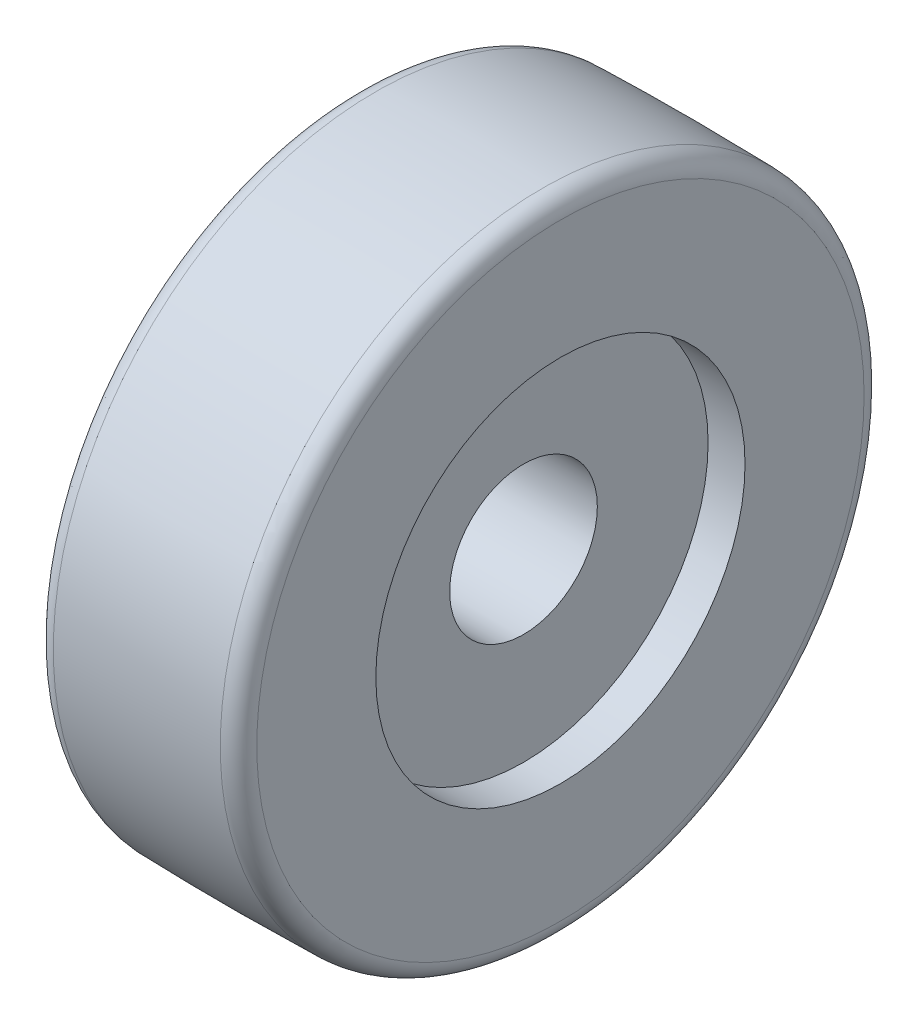
ISO-10303-21;
HEADER;
FILE_DESCRIPTION(('STEP AP214'),'2;1');
FILE_NAME('part.step','',(''),(''),'','','');
FILE_SCHEMA(('AUTOMOTIVE_DESIGN { 1 0 10303 214 1 1 1 1 }'));
ENDSEC;
DATA;
#1=APPLICATION_CONTEXT('core data for automotive mechanical design processes');
#2=APPLICATION_PROTOCOL_DEFINITION('international standard','automotive_design',2000,#1);
#3=PRODUCT_CONTEXT('',#1,'mechanical');
#4=PRODUCT('Part','Part','',(#3));
#5=PRODUCT_RELATED_PRODUCT_CATEGORY('part','',(#4));
#6=PRODUCT_DEFINITION_FORMATION('','',#4);
#7=PRODUCT_DEFINITION_CONTEXT('part definition',#1,'design');
#8=PRODUCT_DEFINITION('design','',#6,#7);
#9=PRODUCT_DEFINITION_SHAPE('','',#8);
#10=(LENGTH_UNIT() NAMED_UNIT(*) SI_UNIT(.MILLI.,.METRE.));
#11=(NAMED_UNIT(*) PLANE_ANGLE_UNIT() SI_UNIT($,.RADIAN.));
#12=(NAMED_UNIT(*) SI_UNIT($,.STERADIAN.) SOLID_ANGLE_UNIT());
#13=UNCERTAINTY_MEASURE_WITH_UNIT(LENGTH_MEASURE(1.E-05),#10,'distance_accuracy_value','');
#14=(GEOMETRIC_REPRESENTATION_CONTEXT(3) GLOBAL_UNCERTAINTY_ASSIGNED_CONTEXT((#13)) GLOBAL_UNIT_ASSIGNED_CONTEXT((#10,
#11,#12)) REPRESENTATION_CONTEXT('',''));
#15=CARTESIAN_POINT('',(0.,0.,0.));
#16=DIRECTION('',(0.,0.,1.));
#17=DIRECTION('',(1.,0.,0.));
#18=AXIS2_PLACEMENT_3D('',#15,#16,#17);
#19=CARTESIAN_POINT('',(-7.87289070741659E-11,0.,0.));
#20=DIRECTION('',(1.,0.,0.));
#21=DIRECTION('',(0.,0.,-1.));
#22=AXIS2_PLACEMENT_3D('',#19,#20,#21);
#23=DEGENERATE_TOROIDAL_SURFACE('',#22,182.499999991458,199.999999991459,.F.);
#24=CARTESIAN_POINT('',(-4.52261306532662,0.,0.));
#25=DIRECTION('',(1.,0.,0.));
#26=DIRECTION('',(0.,0.,-1.));
#27=AXIS2_PLACEMENT_3D('',#24,#25,#26);
#28=CIRCLE('',#27,17.448858388992);
#29=CARTESIAN_POINT('',(-4.52261306532662,0.,-17.448858388992));
#30=VERTEX_POINT('',#29);
#31=EDGE_CURVE('E10',#30,#30,#28,.T.);
#32=ORIENTED_EDGE('',*,*,#31,.T.);
#33=EDGE_LOOP('',(#32));
#34=FACE_BOUND('',#33,.T.);
#35=CARTESIAN_POINT('',(4.52261306532712,0.,0.));
#36=DIRECTION('',(1.,0.,0.));
#37=DIRECTION('',(0.,0.,-1.));
#38=AXIS2_PLACEMENT_3D('',#35,#36,#37);
#39=CIRCLE('',#38,17.4488583889905);
#40=CARTESIAN_POINT('',(4.52261306532712,0.,-17.4488583889905));
#41=VERTEX_POINT('',#40);
#42=EDGE_CURVE('E86',#41,#41,#39,.T.);
#43=ORIENTED_EDGE('',*,*,#42,.F.);
#44=EDGE_LOOP('',(#43));
#45=FACE_BOUND('',#44,.T.);
#46=ADVANCED_FACE('F43',(#34,#45),#23,.F.);
#47=CARTESIAN_POINT('',(-4.5,0.,0.));
#48=DIRECTION('',(1.,0.,0.));
#49=DIRECTION('',(0.,0.,-1.));
#50=AXIS2_PLACEMENT_3D('',#47,#48,#49);
#51=TOROIDAL_SURFACE('',#50,16.4491140970471,0.999999999999966);
#52=CARTESIAN_POINT('',(-5.49999999999997,0.,0.));
#53=DIRECTION('',(1.,0.,0.));
#54=DIRECTION('',(0.,0.,-1.));
#55=AXIS2_PLACEMENT_3D('',#52,#53,#54);
#56=CIRCLE('',#55,16.4491140970471);
#57=CARTESIAN_POINT('',(-5.49999999999997,0.,-16.4491140970471));
#58=VERTEX_POINT('',#57);
#59=EDGE_CURVE('E50',#58,#58,#56,.T.);
#60=ORIENTED_EDGE('',*,*,#59,.T.);
#61=EDGE_LOOP('',(#60));
#62=FACE_BOUND('',#61,.T.);
#63=ORIENTED_EDGE('',*,*,#31,.F.);
#64=EDGE_LOOP('',(#63));
#65=FACE_BOUND('',#64,.T.);
#66=ADVANCED_FACE('F95',(#62,#65),#51,.T.);
#67=CARTESIAN_POINT('',(-5.49999999999998,16.4491140970471,0.));
#68=DIRECTION('',(-1.,0.,0.));
#69=DIRECTION('',(0.,0.,1.));
#70=AXIS2_PLACEMENT_3D('',#67,#68,#69);
#71=PLANE('',#70);
#72=CARTESIAN_POINT('',(-5.5,0.,0.));
#73=DIRECTION('',(1.,0.,0.));
#74=DIRECTION('',(0.,0.,-1.));
#75=AXIS2_PLACEMENT_3D('',#72,#73,#74);
#76=CIRCLE('',#75,10.);
#77=CARTESIAN_POINT('',(-5.5,0.,-10.));
#78=VERTEX_POINT('',#77);
#79=EDGE_CURVE('E55',#78,#78,#76,.T.);
#80=ORIENTED_EDGE('',*,*,#79,.T.);
#81=EDGE_LOOP('',(#80));
#82=FACE_BOUND('',#81,.T.);
#83=ORIENTED_EDGE('',*,*,#59,.F.);
#84=EDGE_LOOP('',(#83));
#85=FACE_BOUND('',#84,.T.);
#86=ADVANCED_FACE('F99',(#82,#85),#71,.T.);
#87=CARTESIAN_POINT('',(-5.5,0.,0.));
#88=DIRECTION('',(1.,0.,0.));
#89=DIRECTION('',(0.,0.,-1.));
#90=AXIS2_PLACEMENT_3D('',#87,#88,#89);
#91=CYLINDRICAL_SURFACE('',#90,10.);
#92=CARTESIAN_POINT('',(-3.5,0.,0.));
#93=DIRECTION('',(1.,0.,0.));
#94=DIRECTION('',(0.,0.,-1.));
#95=AXIS2_PLACEMENT_3D('',#92,#93,#94);
#96=CIRCLE('',#95,10.);
#97=CARTESIAN_POINT('',(-3.5,0.,-10.));
#98=VERTEX_POINT('',#97);
#99=EDGE_CURVE('E60',#98,#98,#96,.T.);
#100=ORIENTED_EDGE('',*,*,#99,.T.);
#101=EDGE_LOOP('',(#100));
#102=FACE_BOUND('',#101,.T.);
#103=ORIENTED_EDGE('',*,*,#79,.F.);
#104=EDGE_LOOP('',(#103));
#105=FACE_BOUND('',#104,.T.);
#106=ADVANCED_FACE('F103',(#102,#105),#91,.F.);
#107=CARTESIAN_POINT('',(-3.5,10.,0.));
#108=DIRECTION('',(-1.,0.,0.));
#109=DIRECTION('',(0.,0.,1.));
#110=AXIS2_PLACEMENT_3D('',#107,#108,#109);
#111=PLANE('',#110);
#112=CARTESIAN_POINT('',(-3.5,0.,0.));
#113=DIRECTION('',(1.,0.,0.));
#114=DIRECTION('',(0.,0.,-1.));
#115=AXIS2_PLACEMENT_3D('',#112,#113,#114);
#116=CIRCLE('',#115,4.);
#117=CARTESIAN_POINT('',(-3.5,0.,-4.));
#118=VERTEX_POINT('',#117);
#119=EDGE_CURVE('E66',#118,#118,#116,.T.);
#120=ORIENTED_EDGE('',*,*,#119,.T.);
#121=EDGE_LOOP('',(#120));
#122=FACE_BOUND('',#121,.T.);
#123=ORIENTED_EDGE('',*,*,#99,.F.);
#124=EDGE_LOOP('',(#123));
#125=FACE_BOUND('',#124,.T.);
#126=ADVANCED_FACE('F110',(#122,#125),#111,.T.);
#127=CARTESIAN_POINT('',(-5.5,0.,0.));
#128=DIRECTION('',(1.,0.,0.));
#129=DIRECTION('',(0.,0.,-1.));
#130=AXIS2_PLACEMENT_3D('',#127,#128,#129);
#131=CYLINDRICAL_SURFACE('',#130,4.);
#132=CARTESIAN_POINT('',(3.5,0.,0.));
#133=DIRECTION('',(1.,0.,0.));
#134=DIRECTION('',(0.,0.,-1.));
#135=AXIS2_PLACEMENT_3D('',#132,#133,#134);
#136=CIRCLE('',#135,4.);
#137=CARTESIAN_POINT('',(3.5,0.,-4.));
#138=VERTEX_POINT('',#137);
#139=EDGE_CURVE('E70',#138,#138,#136,.T.);
#140=ORIENTED_EDGE('',*,*,#139,.T.);
#141=EDGE_LOOP('',(#140));
#142=FACE_BOUND('',#141,.T.);
#143=ORIENTED_EDGE('',*,*,#119,.F.);
#144=EDGE_LOOP('',(#143));
#145=FACE_BOUND('',#144,.T.);
#146=ADVANCED_FACE('F114',(#142,#145),#131,.F.);
#147=CARTESIAN_POINT('',(3.5,4.,0.));
#148=DIRECTION('',(1.,0.,0.));
#149=DIRECTION('',(0.,0.,-1.));
#150=AXIS2_PLACEMENT_3D('',#147,#148,#149);
#151=PLANE('',#150);
#152=CARTESIAN_POINT('',(3.5,0.,0.));
#153=DIRECTION('',(1.,0.,0.));
#154=DIRECTION('',(0.,0.,-1.));
#155=AXIS2_PLACEMENT_3D('',#152,#153,#154);
#156=CIRCLE('',#155,10.);
#157=CARTESIAN_POINT('',(3.5,0.,-10.));
#158=VERTEX_POINT('',#157);
#159=EDGE_CURVE('E74',#158,#158,#156,.T.);
#160=ORIENTED_EDGE('',*,*,#159,.T.);
#161=EDGE_LOOP('',(#160));
#162=FACE_BOUND('',#161,.T.);
#163=ORIENTED_EDGE('',*,*,#139,.F.);
#164=EDGE_LOOP('',(#163));
#165=FACE_BOUND('',#164,.T.);
#166=ADVANCED_FACE('F118',(#162,#165),#151,.T.);
#167=CARTESIAN_POINT('',(-5.5,0.,0.));
#168=DIRECTION('',(1.,0.,0.));
#169=DIRECTION('',(0.,0.,-1.));
#170=AXIS2_PLACEMENT_3D('',#167,#168,#169);
#171=CYLINDRICAL_SURFACE('',#170,10.);
#172=CARTESIAN_POINT('',(5.5,0.,0.));
#173=DIRECTION('',(1.,0.,0.));
#174=DIRECTION('',(0.,0.,-1.));
#175=AXIS2_PLACEMENT_3D('',#172,#173,#174);
#176=CIRCLE('',#175,10.);
#177=CARTESIAN_POINT('',(5.5,0.,-10.));
#178=VERTEX_POINT('',#177);
#179=EDGE_CURVE('E78',#178,#178,#176,.T.);
#180=ORIENTED_EDGE('',*,*,#179,.T.);
#181=EDGE_LOOP('',(#180));
#182=FACE_BOUND('',#181,.T.);
#183=ORIENTED_EDGE('',*,*,#159,.F.);
#184=EDGE_LOOP('',(#183));
#185=FACE_BOUND('',#184,.T.);
#186=ADVANCED_FACE('F122',(#182,#185),#171,.F.);
#187=CARTESIAN_POINT('',(5.5,10.,0.));
#188=DIRECTION('',(1.,0.,0.));
#189=DIRECTION('',(0.,0.,-1.));
#190=AXIS2_PLACEMENT_3D('',#187,#188,#189);
#191=PLANE('',#190);
#192=CARTESIAN_POINT('',(5.5,0.,0.));
#193=DIRECTION('',(1.,0.,0.));
#194=DIRECTION('',(0.,0.,-1.));
#195=AXIS2_PLACEMENT_3D('',#192,#193,#194);
#196=CIRCLE('',#195,16.4491140970467);
#197=CARTESIAN_POINT('',(5.5,0.,-16.4491140970467));
#198=VERTEX_POINT('',#197);
#199=EDGE_CURVE('E82',#198,#198,#196,.T.);
#200=ORIENTED_EDGE('',*,*,#199,.T.);
#201=EDGE_LOOP('',(#200));
#202=FACE_BOUND('',#201,.T.);
#203=ORIENTED_EDGE('',*,*,#179,.F.);
#204=EDGE_LOOP('',(#203));
#205=FACE_BOUND('',#204,.T.);
#206=ADVANCED_FACE('F126',(#202,#205),#191,.T.);
#207=CARTESIAN_POINT('',(4.49999999999915,0.,0.));
#208=DIRECTION('',(1.,0.,0.));
#209=DIRECTION('',(0.,0.,-1.));
#210=AXIS2_PLACEMENT_3D('',#207,#208,#209);
#211=TOROIDAL_SURFACE('',#210,16.4491140970467,0.999999999998861);
#212=ORIENTED_EDGE('',*,*,#42,.T.);
#213=EDGE_LOOP('',(#212));
#214=FACE_BOUND('',#213,.T.);
#215=ORIENTED_EDGE('',*,*,#199,.F.);
#216=EDGE_LOOP('',(#215));
#217=FACE_BOUND('',#216,.T.);
#218=ADVANCED_FACE('F91',(#214,#217),#211,.T.);
#219=CLOSED_SHELL('',(#46,#66,#86,#106,#126,#146,#166,#186,#206,#218));
#220=MANIFOLD_SOLID_BREP('B2',#219);
#221=ADVANCED_BREP_SHAPE_REPRESENTATION('',(#18,#220),#14);
#222=SHAPE_DEFINITION_REPRESENTATION(#9,#221);
ENDSEC;
END-ISO-10303-21;
